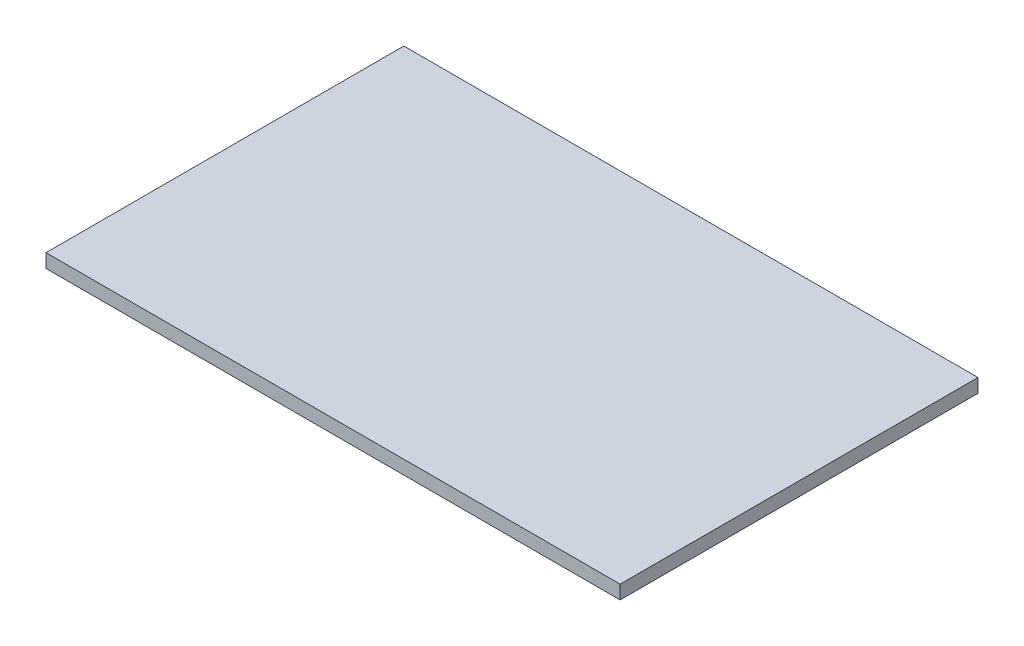
ISO-10303-21;
HEADER;
FILE_DESCRIPTION(('STEP AP214'),'2;1');
FILE_NAME('part.step','',(''),(''),'','','');
FILE_SCHEMA(('AUTOMOTIVE_DESIGN { 1 0 10303 214 1 1 1 1 }'));
ENDSEC;
DATA;
#1=APPLICATION_CONTEXT('core data for automotive mechanical design processes');
#2=APPLICATION_PROTOCOL_DEFINITION('international standard','automotive_design',2000,#1);
#3=PRODUCT_CONTEXT('',#1,'mechanical');
#4=PRODUCT('Part','Part','',(#3));
#5=PRODUCT_RELATED_PRODUCT_CATEGORY('part','',(#4));
#6=PRODUCT_DEFINITION_FORMATION('','',#4);
#7=PRODUCT_DEFINITION_CONTEXT('part definition',#1,'design');
#8=PRODUCT_DEFINITION('design','',#6,#7);
#9=PRODUCT_DEFINITION_SHAPE('','',#8);
#10=(LENGTH_UNIT() NAMED_UNIT(*) SI_UNIT(.MILLI.,.METRE.));
#11=(NAMED_UNIT(*) PLANE_ANGLE_UNIT() SI_UNIT($,.RADIAN.));
#12=(NAMED_UNIT(*) SI_UNIT($,.STERADIAN.) SOLID_ANGLE_UNIT());
#13=UNCERTAINTY_MEASURE_WITH_UNIT(LENGTH_MEASURE(1.E-05),#10,'distance_accuracy_value','');
#14=(GEOMETRIC_REPRESENTATION_CONTEXT(3) GLOBAL_UNCERTAINTY_ASSIGNED_CONTEXT((#13)) GLOBAL_UNIT_ASSIGNED_CONTEXT((#10,
#11,#12)) REPRESENTATION_CONTEXT('',''));
#15=CARTESIAN_POINT('',(0.,0.,0.));
#16=DIRECTION('',(0.,0.,1.));
#17=DIRECTION('',(1.,0.,0.));
#18=AXIS2_PLACEMENT_3D('',#15,#16,#17);
#19=CARTESIAN_POINT('',(377.,18.,-235.));
#20=DIRECTION('',(-1.,0.,0.));
#21=DIRECTION('',(0.,0.,1.));
#22=AXIS2_PLACEMENT_3D('',#19,#20,#21);
#23=PLANE('',#22);
#24=DIRECTION('',(0.,0.,-1.));
#25=VECTOR('',#24,1.);
#26=CARTESIAN_POINT('',(377.,0.,-235.));
#27=LINE('',#26,#25);
#28=CARTESIAN_POINT('',(377.,0.,235.));
#29=VERTEX_POINT('',#28);
#30=CARTESIAN_POINT('',(377.,0.,-235.));
#31=VERTEX_POINT('',#30);
#32=EDGE_CURVE('E95',#29,#31,#27,.T.);
#33=ORIENTED_EDGE('',*,*,#32,.T.);
#34=DIRECTION('',(0.,-1.,0.));
#35=VECTOR('',#34,1.);
#36=CARTESIAN_POINT('',(377.,18.,-235.));
#37=LINE('',#36,#35);
#38=CARTESIAN_POINT('',(377.,18.,-235.));
#39=VERTEX_POINT('',#38);
#40=EDGE_CURVE('E11',#39,#31,#37,.T.);
#41=ORIENTED_EDGE('',*,*,#40,.F.);
#42=DIRECTION('',(0.,0.,-1.));
#43=VECTOR('',#42,1.);
#44=CARTESIAN_POINT('',(377.,18.,-235.));
#45=LINE('',#44,#43);
#46=CARTESIAN_POINT('',(377.,18.,235.));
#47=VERTEX_POINT('',#46);
#48=EDGE_CURVE('E83',#47,#39,#45,.T.);
#49=ORIENTED_EDGE('',*,*,#48,.F.);
#50=DIRECTION('',(0.,-1.,0.));
#51=VECTOR('',#50,1.);
#52=CARTESIAN_POINT('',(377.,18.,235.));
#53=LINE('',#52,#51);
#54=EDGE_CURVE('E91',#47,#29,#53,.T.);
#55=ORIENTED_EDGE('',*,*,#54,.T.);
#56=EDGE_LOOP('',(#33,#41,#49,#55));
#57=FACE_BOUND('',#56,.T.);
#58=ADVANCED_FACE('F32',(#57),#23,.F.);
#59=CARTESIAN_POINT('',(-377.,18.,-235.));
#60=DIRECTION('',(0.,0.,1.));
#61=DIRECTION('',(1.,0.,0.));
#62=AXIS2_PLACEMENT_3D('',#59,#60,#61);
#63=PLANE('',#62);
#64=DIRECTION('',(-1.,0.,0.));
#65=VECTOR('',#64,1.);
#66=CARTESIAN_POINT('',(-377.,0.,-235.));
#67=LINE('',#66,#65);
#68=CARTESIAN_POINT('',(-377.,0.,-235.));
#69=VERTEX_POINT('',#68);
#70=EDGE_CURVE('E87',#31,#69,#67,.T.);
#71=ORIENTED_EDGE('',*,*,#70,.T.);
#72=DIRECTION('',(0.,-1.,0.));
#73=VECTOR('',#72,1.);
#74=CARTESIAN_POINT('',(-377.,18.,-235.));
#75=LINE('',#74,#73);
#76=CARTESIAN_POINT('',(-377.,18.,-235.));
#77=VERTEX_POINT('',#76);
#78=EDGE_CURVE('E40',#77,#69,#75,.T.);
#79=ORIENTED_EDGE('',*,*,#78,.F.);
#80=DIRECTION('',(-1.,0.,0.));
#81=VECTOR('',#80,1.);
#82=CARTESIAN_POINT('',(-377.,18.,-235.));
#83=LINE('',#82,#81);
#84=EDGE_CURVE('E78',#39,#77,#83,.T.);
#85=ORIENTED_EDGE('',*,*,#84,.F.);
#86=ORIENTED_EDGE('',*,*,#40,.T.);
#87=EDGE_LOOP('',(#71,#79,#85,#86));
#88=FACE_BOUND('',#87,.T.);
#89=ADVANCED_FACE('F86',(#88),#63,.F.);
#90=CARTESIAN_POINT('',(-377.,18.,-235.));
#91=DIRECTION('',(1.,0.,0.));
#92=DIRECTION('',(0.,0.,-1.));
#93=AXIS2_PLACEMENT_3D('',#90,#91,#92);
#94=PLANE('',#93);
#95=DIRECTION('',(0.,0.,1.));
#96=VECTOR('',#95,1.);
#97=CARTESIAN_POINT('',(-377.,0.,-235.));
#98=LINE('',#97,#96);
#99=CARTESIAN_POINT('',(-377.,0.,235.));
#100=VERTEX_POINT('',#99);
#101=EDGE_CURVE('E65',#69,#100,#98,.T.);
#102=ORIENTED_EDGE('',*,*,#101,.T.);
#103=DIRECTION('',(0.,-1.,0.));
#104=VECTOR('',#103,1.);
#105=CARTESIAN_POINT('',(-377.,18.,235.));
#106=LINE('',#105,#104);
#107=CARTESIAN_POINT('',(-377.,18.,235.));
#108=VERTEX_POINT('',#107);
#109=EDGE_CURVE('E88',#108,#100,#106,.T.);
#110=ORIENTED_EDGE('',*,*,#109,.F.);
#111=DIRECTION('',(0.,0.,1.));
#112=VECTOR('',#111,1.);
#113=CARTESIAN_POINT('',(-377.,18.,-235.));
#114=LINE('',#113,#112);
#115=EDGE_CURVE('E81',#77,#108,#114,.T.);
#116=ORIENTED_EDGE('',*,*,#115,.F.);
#117=ORIENTED_EDGE('',*,*,#78,.T.);
#118=EDGE_LOOP('',(#102,#110,#116,#117));
#119=FACE_BOUND('',#118,.T.);
#120=ADVANCED_FACE('F89',(#119),#94,.F.);
#121=CARTESIAN_POINT('',(-377.,18.,235.));
#122=DIRECTION('',(0.,0.,-1.));
#123=DIRECTION('',(-1.,0.,0.));
#124=AXIS2_PLACEMENT_3D('',#121,#122,#123);
#125=PLANE('',#124);
#126=DIRECTION('',(1.,0.,0.));
#127=VECTOR('',#126,1.);
#128=CARTESIAN_POINT('',(-377.,0.,235.));
#129=LINE('',#128,#127);
#130=EDGE_CURVE('E71',#100,#29,#129,.T.);
#131=ORIENTED_EDGE('',*,*,#130,.T.);
#132=ORIENTED_EDGE('',*,*,#54,.F.);
#133=DIRECTION('',(1.,0.,0.));
#134=VECTOR('',#133,1.);
#135=CARTESIAN_POINT('',(-377.,18.,235.));
#136=LINE('',#135,#134);
#137=EDGE_CURVE('E48',#108,#47,#136,.T.);
#138=ORIENTED_EDGE('',*,*,#137,.F.);
#139=ORIENTED_EDGE('',*,*,#109,.T.);
#140=EDGE_LOOP('',(#131,#132,#138,#139));
#141=FACE_BOUND('',#140,.T.);
#142=ADVANCED_FACE('F102',(#141),#125,.F.);
#143=CARTESIAN_POINT('',(0.,18.,0.));
#144=DIRECTION('',(0.,1.,0.));
#145=DIRECTION('',(0.,0.,1.));
#146=AXIS2_PLACEMENT_3D('',#143,#144,#145);
#147=PLANE('',#146);
#148=ORIENTED_EDGE('',*,*,#48,.T.);
#149=ORIENTED_EDGE('',*,*,#84,.T.);
#150=ORIENTED_EDGE('',*,*,#115,.T.);
#151=ORIENTED_EDGE('',*,*,#137,.T.);
#152=EDGE_LOOP('',(#148,#149,#150,#151));
#153=FACE_BOUND('',#152,.T.);
#154=ADVANCED_FACE('F79',(#153),#147,.T.);
#155=CARTESIAN_POINT('',(0.,0.,0.));
#156=DIRECTION('',(0.,1.,0.));
#157=DIRECTION('',(0.,0.,1.));
#158=AXIS2_PLACEMENT_3D('',#155,#156,#157);
#159=PLANE('',#158);
#160=ORIENTED_EDGE('',*,*,#32,.F.);
#161=ORIENTED_EDGE('',*,*,#130,.F.);
#162=ORIENTED_EDGE('',*,*,#101,.F.);
#163=ORIENTED_EDGE('',*,*,#70,.F.);
#164=EDGE_LOOP('',(#160,#161,#162,#163));
#165=FACE_BOUND('',#164,.T.);
#166=ADVANCED_FACE('F105',(#165),#159,.F.);
#167=CLOSED_SHELL('',(#58,#89,#120,#142,#154,#166));
#168=MANIFOLD_SOLID_BREP('B2',#167);
#169=ADVANCED_BREP_SHAPE_REPRESENTATION('',(#18,#168),#14);
#170=SHAPE_DEFINITION_REPRESENTATION(#9,#169);
ENDSEC;
END-ISO-10303-21;
